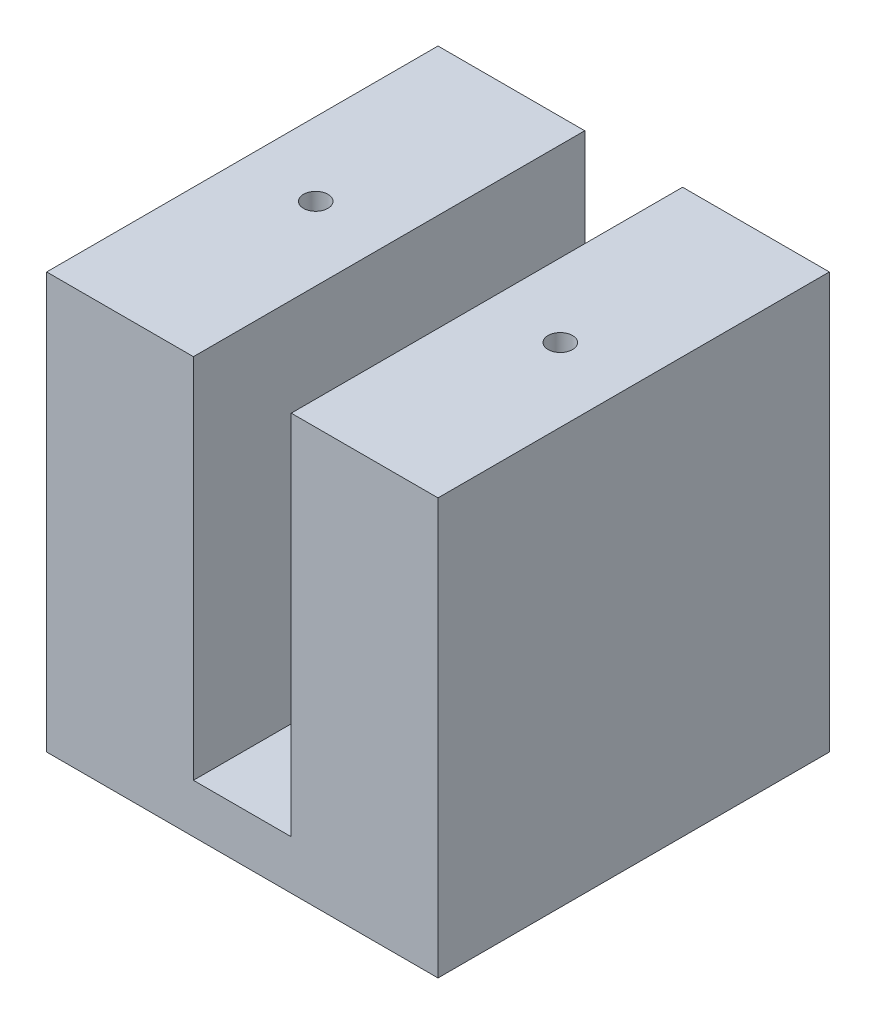
ISO-10303-21;
HEADER;
FILE_DESCRIPTION(('STEP AP214'),'2;1');
FILE_NAME('part.step','',(''),(''),'','','');
FILE_SCHEMA(('AUTOMOTIVE_DESIGN { 1 0 10303 214 1 1 1 1 }'));
ENDSEC;
DATA;
#1=APPLICATION_CONTEXT('core data for automotive mechanical design processes');
#2=APPLICATION_PROTOCOL_DEFINITION('international standard','automotive_design',2000,#1);
#3=PRODUCT_CONTEXT('',#1,'mechanical');
#4=PRODUCT('Part','Part','',(#3));
#5=PRODUCT_RELATED_PRODUCT_CATEGORY('part','',(#4));
#6=PRODUCT_DEFINITION_FORMATION('','',#4);
#7=PRODUCT_DEFINITION_CONTEXT('part definition',#1,'design');
#8=PRODUCT_DEFINITION('design','',#6,#7);
#9=PRODUCT_DEFINITION_SHAPE('','',#8);
#10=(LENGTH_UNIT() NAMED_UNIT(*) SI_UNIT(.MILLI.,.METRE.));
#11=(NAMED_UNIT(*) PLANE_ANGLE_UNIT() SI_UNIT($,.RADIAN.));
#12=(NAMED_UNIT(*) SI_UNIT($,.STERADIAN.) SOLID_ANGLE_UNIT());
#13=UNCERTAINTY_MEASURE_WITH_UNIT(LENGTH_MEASURE(1.E-05),#10,'distance_accuracy_value','');
#14=(GEOMETRIC_REPRESENTATION_CONTEXT(3) GLOBAL_UNCERTAINTY_ASSIGNED_CONTEXT((#13)) GLOBAL_UNIT_ASSIGNED_CONTEXT((#10,
#11,#12)) REPRESENTATION_CONTEXT('',''));
#15=CARTESIAN_POINT('',(0.,0.,0.));
#16=DIRECTION('',(0.,0.,1.));
#17=DIRECTION('',(1.,0.,0.));
#18=AXIS2_PLACEMENT_3D('',#15,#16,#17);
#19=CARTESIAN_POINT('',(0.,6.35,0.));
#20=DIRECTION('',(0.,-1.,0.));
#21=DIRECTION('',(0.,0.,-1.));
#22=AXIS2_PLACEMENT_3D('',#19,#20,#21);
#23=PLANE('',#22);
#24=CARTESIAN_POINT('',(0.,6.35,-6.35));
#25=DIRECTION('',(0.,1.,0.));
#26=DIRECTION('',(0.,0.,1.));
#27=AXIS2_PLACEMENT_3D('',#24,#25,#26);
#28=CIRCLE('',#27,1.5875);
#29=CARTESIAN_POINT('',(0.,6.35,-4.7625));
#30=VERTEX_POINT('',#29);
#31=EDGE_CURVE('E322',#30,#30,#28,.T.);
#32=ORIENTED_EDGE('',*,*,#31,.F.);
#33=EDGE_LOOP('',(#32));
#34=FACE_BOUND('',#33,.T.);
#35=CARTESIAN_POINT('',(0.,6.35,6.35));
#36=DIRECTION('',(0.,1.,0.));
#37=DIRECTION('',(0.,0.,1.));
#38=AXIS2_PLACEMENT_3D('',#35,#36,#37);
#39=CIRCLE('',#38,1.5875);
#40=CARTESIAN_POINT('',(0.,6.35,7.9375));
#41=VERTEX_POINT('',#40);
#42=EDGE_CURVE('E130',#41,#41,#39,.T.);
#43=ORIENTED_EDGE('',*,*,#42,.F.);
#44=EDGE_LOOP('',(#43));
#45=FACE_BOUND('',#44,.T.);
#46=DIRECTION('',(0.,0.,1.));
#47=VECTOR('',#46,1.);
#48=CARTESIAN_POINT('',(6.34999999999999,6.35,-25.4));
#49=LINE('',#48,#47);
#50=CARTESIAN_POINT('',(6.34999999999999,6.35,-25.4));
#51=VERTEX_POINT('',#50);
#52=CARTESIAN_POINT('',(6.34999999999999,6.35,25.4));
#53=VERTEX_POINT('',#52);
#54=EDGE_CURVE('E55',#51,#53,#49,.T.);
#55=ORIENTED_EDGE('',*,*,#54,.F.);
#56=DIRECTION('',(-1.,0.,0.));
#57=VECTOR('',#56,1.);
#58=CARTESIAN_POINT('',(-25.4,6.35,-25.4));
#59=LINE('',#58,#57);
#60=CARTESIAN_POINT('',(-6.35,6.35,-25.4));
#61=VERTEX_POINT('',#60);
#62=EDGE_CURVE('E169',#51,#61,#59,.T.);
#63=ORIENTED_EDGE('',*,*,#62,.T.);
#64=DIRECTION('',(0.,0.,-1.));
#65=VECTOR('',#64,1.);
#66=CARTESIAN_POINT('',(-6.35,6.35,-25.4));
#67=LINE('',#66,#65);
#68=CARTESIAN_POINT('',(-6.35,6.35,25.4));
#69=VERTEX_POINT('',#68);
#70=EDGE_CURVE('E143',#69,#61,#67,.T.);
#71=ORIENTED_EDGE('',*,*,#70,.F.);
#72=DIRECTION('',(1.,0.,0.));
#73=VECTOR('',#72,1.);
#74=CARTESIAN_POINT('',(-25.4,6.35,25.4));
#75=LINE('',#74,#73);
#76=EDGE_CURVE('E60',#69,#53,#75,.T.);
#77=ORIENTED_EDGE('',*,*,#76,.T.);
#78=EDGE_LOOP('',(#55,#63,#71,#77));
#79=FACE_BOUND('',#78,.T.);
#80=ADVANCED_FACE('F39',(#34,#45,#79),#23,.F.);
#81=CARTESIAN_POINT('',(25.4,6.35,25.4));
#82=DIRECTION('',(-1.,0.,0.));
#83=DIRECTION('',(0.,0.,1.));
#84=AXIS2_PLACEMENT_3D('',#81,#82,#83);
#85=PLANE('',#84);
#86=DIRECTION('',(0.,0.,-1.));
#87=VECTOR('',#86,1.);
#88=CARTESIAN_POINT('',(25.4,0.,25.4));
#89=LINE('',#88,#87);
#90=CARTESIAN_POINT('',(25.4,0.,25.4));
#91=VERTEX_POINT('',#90);
#92=CARTESIAN_POINT('',(25.4,0.,-25.4));
#93=VERTEX_POINT('',#92);
#94=EDGE_CURVE('E108',#91,#93,#89,.T.);
#95=ORIENTED_EDGE('',*,*,#94,.T.);
#96=DIRECTION('',(0.,-1.,0.));
#97=VECTOR('',#96,1.);
#98=CARTESIAN_POINT('',(25.4,6.35,-25.4));
#99=LINE('',#98,#97);
#100=CARTESIAN_POINT('',(25.4,53.975,-25.4));
#101=VERTEX_POINT('',#100);
#102=EDGE_CURVE('E11',#101,#93,#99,.T.);
#103=ORIENTED_EDGE('',*,*,#102,.F.);
#104=DIRECTION('',(0.,0.,-1.));
#105=VECTOR('',#104,1.);
#106=CARTESIAN_POINT('',(25.4,53.975,-25.4));
#107=LINE('',#106,#105);
#108=CARTESIAN_POINT('',(25.4,53.975,25.4));
#109=VERTEX_POINT('',#108);
#110=EDGE_CURVE('E106',#109,#101,#107,.T.);
#111=ORIENTED_EDGE('',*,*,#110,.F.);
#112=DIRECTION('',(0.,-1.,0.));
#113=VECTOR('',#112,1.);
#114=CARTESIAN_POINT('',(25.4,6.35,25.4));
#115=LINE('',#114,#113);
#116=EDGE_CURVE('E175',#109,#91,#115,.T.);
#117=ORIENTED_EDGE('',*,*,#116,.T.);
#118=EDGE_LOOP('',(#95,#103,#111,#117));
#119=FACE_BOUND('',#118,.T.);
#120=ADVANCED_FACE('F41',(#119),#85,.F.);
#121=CARTESIAN_POINT('',(-25.4,6.35,-25.4));
#122=DIRECTION('',(0.,0.,1.));
#123=DIRECTION('',(1.,0.,0.));
#124=AXIS2_PLACEMENT_3D('',#121,#122,#123);
#125=PLANE('',#124);
#126=DIRECTION('',(-1.,0.,0.));
#127=VECTOR('',#126,1.);
#128=CARTESIAN_POINT('',(-25.4,0.,-25.4));
#129=LINE('',#128,#127);
#130=CARTESIAN_POINT('',(-25.4,0.,-25.4));
#131=VERTEX_POINT('',#130);
#132=EDGE_CURVE('E178',#93,#131,#129,.T.);
#133=ORIENTED_EDGE('',*,*,#132,.T.);
#134=DIRECTION('',(0.,-1.,0.));
#135=VECTOR('',#134,1.);
#136=CARTESIAN_POINT('',(-25.4,6.35,-25.4));
#137=LINE('',#136,#135);
#138=CARTESIAN_POINT('',(-25.4,53.975,-25.4));
#139=VERTEX_POINT('',#138);
#140=EDGE_CURVE('E48',#139,#131,#137,.T.);
#141=ORIENTED_EDGE('',*,*,#140,.F.);
#142=DIRECTION('',(-1.,0.,0.));
#143=VECTOR('',#142,1.);
#144=CARTESIAN_POINT('',(-25.4,53.975,-25.4));
#145=LINE('',#144,#143);
#146=CARTESIAN_POINT('',(-6.35,53.975,-25.4));
#147=VERTEX_POINT('',#146);
#148=EDGE_CURVE('E154',#147,#139,#145,.T.);
#149=ORIENTED_EDGE('',*,*,#148,.F.);
#150=DIRECTION('',(0.,-1.,0.));
#151=VECTOR('',#150,1.);
#152=CARTESIAN_POINT('',(-6.35,53.975,-25.4));
#153=LINE('',#152,#151);
#154=EDGE_CURVE('E158',#147,#61,#153,.T.);
#155=ORIENTED_EDGE('',*,*,#154,.T.);
#156=ORIENTED_EDGE('',*,*,#62,.F.);
#157=DIRECTION('',(0.,-1.,0.));
#158=VECTOR('',#157,1.);
#159=CARTESIAN_POINT('',(6.34999999999999,53.975,-25.4));
#160=LINE('',#159,#158);
#161=CARTESIAN_POINT('',(6.34999999999999,53.975,-25.4));
#162=VERTEX_POINT('',#161);
#163=EDGE_CURVE('E114',#162,#51,#160,.T.);
#164=ORIENTED_EDGE('',*,*,#163,.F.);
#165=DIRECTION('',(-1.,0.,0.));
#166=VECTOR('',#165,1.);
#167=CARTESIAN_POINT('',(25.4,53.975,-25.4));
#168=LINE('',#167,#166);
#169=EDGE_CURVE('E111',#101,#162,#168,.T.);
#170=ORIENTED_EDGE('',*,*,#169,.F.);
#171=ORIENTED_EDGE('',*,*,#102,.T.);
#172=EDGE_LOOP('',(#133,#141,#149,#155,#156,#164,#170,#171));
#173=FACE_BOUND('',#172,.T.);
#174=ADVANCED_FACE('F112',(#173),#125,.F.);
#175=CARTESIAN_POINT('',(-25.4,6.35,25.4));
#176=DIRECTION('',(1.,0.,0.));
#177=DIRECTION('',(0.,0.,-1.));
#178=AXIS2_PLACEMENT_3D('',#175,#176,#177);
#179=PLANE('',#178);
#180=DIRECTION('',(0.,0.,1.));
#181=VECTOR('',#180,1.);
#182=CARTESIAN_POINT('',(-25.4,0.,25.4));
#183=LINE('',#182,#181);
#184=CARTESIAN_POINT('',(-25.4,0.,25.4));
#185=VERTEX_POINT('',#184);
#186=EDGE_CURVE('E181',#131,#185,#183,.T.);
#187=ORIENTED_EDGE('',*,*,#186,.T.);
#188=DIRECTION('',(0.,-1.,0.));
#189=VECTOR('',#188,1.);
#190=CARTESIAN_POINT('',(-25.4,6.35,25.4));
#191=LINE('',#190,#189);
#192=CARTESIAN_POINT('',(-25.4,53.975,25.4));
#193=VERTEX_POINT('',#192);
#194=EDGE_CURVE('E188',#193,#185,#191,.T.);
#195=ORIENTED_EDGE('',*,*,#194,.F.);
#196=DIRECTION('',(0.,0.,1.));
#197=VECTOR('',#196,1.);
#198=CARTESIAN_POINT('',(-25.4,53.975,-25.4));
#199=LINE('',#198,#197);
#200=EDGE_CURVE('E144',#139,#193,#199,.T.);
#201=ORIENTED_EDGE('',*,*,#200,.F.);
#202=ORIENTED_EDGE('',*,*,#140,.T.);
#203=EDGE_LOOP('',(#187,#195,#201,#202));
#204=FACE_BOUND('',#203,.T.);
#205=ADVANCED_FACE('F196',(#204),#179,.F.);
#206=CARTESIAN_POINT('',(-25.4,6.35,25.4));
#207=DIRECTION('',(0.,0.,-1.));
#208=DIRECTION('',(-1.,0.,0.));
#209=AXIS2_PLACEMENT_3D('',#206,#207,#208);
#210=PLANE('',#209);
#211=DIRECTION('',(1.,0.,0.));
#212=VECTOR('',#211,1.);
#213=CARTESIAN_POINT('',(-25.4,0.,25.4));
#214=LINE('',#213,#212);
#215=EDGE_CURVE('E172',#185,#91,#214,.T.);
#216=ORIENTED_EDGE('',*,*,#215,.T.);
#217=ORIENTED_EDGE('',*,*,#116,.F.);
#218=DIRECTION('',(1.,0.,0.));
#219=VECTOR('',#218,1.);
#220=CARTESIAN_POINT('',(25.4,53.975,25.4));
#221=LINE('',#220,#219);
#222=CARTESIAN_POINT('',(6.35,53.975,25.4));
#223=VERTEX_POINT('',#222);
#224=EDGE_CURVE('E123',#223,#109,#221,.T.);
#225=ORIENTED_EDGE('',*,*,#224,.F.);
#226=DIRECTION('',(0.,-1.,0.));
#227=VECTOR('',#226,1.);
#228=CARTESIAN_POINT('',(6.35,53.975,25.4));
#229=LINE('',#228,#227);
#230=EDGE_CURVE('E136',#223,#53,#229,.T.);
#231=ORIENTED_EDGE('',*,*,#230,.T.);
#232=ORIENTED_EDGE('',*,*,#76,.F.);
#233=DIRECTION('',(0.,-1.,0.));
#234=VECTOR('',#233,1.);
#235=CARTESIAN_POINT('',(-6.34999999999999,53.975,25.4));
#236=LINE('',#235,#234);
#237=CARTESIAN_POINT('',(-6.34999999999999,53.975,25.4));
#238=VERTEX_POINT('',#237);
#239=EDGE_CURVE('E165',#238,#69,#236,.T.);
#240=ORIENTED_EDGE('',*,*,#239,.F.);
#241=DIRECTION('',(1.,0.,0.));
#242=VECTOR('',#241,1.);
#243=CARTESIAN_POINT('',(-25.4,53.975,25.4));
#244=LINE('',#243,#242);
#245=EDGE_CURVE('E148',#193,#238,#244,.T.);
#246=ORIENTED_EDGE('',*,*,#245,.F.);
#247=ORIENTED_EDGE('',*,*,#194,.T.);
#248=EDGE_LOOP('',(#216,#217,#225,#231,#232,#240,#246,#247));
#249=FACE_BOUND('',#248,.T.);
#250=ADVANCED_FACE('F202',(#249),#210,.F.);
#251=CARTESIAN_POINT('',(0.,0.,0.));
#252=DIRECTION('',(0.,-1.,0.));
#253=DIRECTION('',(0.,0.,-1.));
#254=AXIS2_PLACEMENT_3D('',#251,#252,#253);
#255=PLANE('',#254);
#256=CARTESIAN_POINT('',(-15.875,0.,0.));
#257=DIRECTION('',(0.,1.,0.));
#258=DIRECTION('',(0.,0.,1.));
#259=AXIS2_PLACEMENT_3D('',#256,#257,#258);
#260=CIRCLE('',#259,1.5875);
#261=CARTESIAN_POINT('',(-15.875,0.,1.5875));
#262=VERTEX_POINT('',#261);
#263=EDGE_CURVE('E319',#262,#262,#260,.T.);
#264=ORIENTED_EDGE('',*,*,#263,.T.);
#265=EDGE_LOOP('',(#264));
#266=FACE_BOUND('',#265,.T.);
#267=CARTESIAN_POINT('',(15.875,0.,0.));
#268=DIRECTION('',(0.,1.,0.));
#269=DIRECTION('',(0.,0.,1.));
#270=AXIS2_PLACEMENT_3D('',#267,#268,#269);
#271=CIRCLE('',#270,1.5875);
#272=CARTESIAN_POINT('',(15.875,0.,1.5875));
#273=VERTEX_POINT('',#272);
#274=EDGE_CURVE('E328',#273,#273,#271,.T.);
#275=ORIENTED_EDGE('',*,*,#274,.T.);
#276=EDGE_LOOP('',(#275));
#277=FACE_BOUND('',#276,.T.);
#278=CARTESIAN_POINT('',(0.,0.,-6.35));
#279=DIRECTION('',(0.,1.,0.));
#280=DIRECTION('',(0.,0.,1.));
#281=AXIS2_PLACEMENT_3D('',#278,#279,#280);
#282=CIRCLE('',#281,1.5875);
#283=CARTESIAN_POINT('',(0.,0.,-4.7625));
#284=VERTEX_POINT('',#283);
#285=EDGE_CURVE('E127',#284,#284,#282,.T.);
#286=ORIENTED_EDGE('',*,*,#285,.T.);
#287=EDGE_LOOP('',(#286));
#288=FACE_BOUND('',#287,.T.);
#289=CARTESIAN_POINT('',(0.,0.,6.35));
#290=DIRECTION('',(0.,1.,0.));
#291=DIRECTION('',(0.,0.,1.));
#292=AXIS2_PLACEMENT_3D('',#289,#290,#291);
#293=CIRCLE('',#292,1.5875);
#294=CARTESIAN_POINT('',(0.,0.,7.9375));
#295=VERTEX_POINT('',#294);
#296=EDGE_CURVE('E315',#295,#295,#293,.T.);
#297=ORIENTED_EDGE('',*,*,#296,.T.);
#298=EDGE_LOOP('',(#297));
#299=FACE_BOUND('',#298,.T.);
#300=ORIENTED_EDGE('',*,*,#94,.F.);
#301=ORIENTED_EDGE('',*,*,#215,.F.);
#302=ORIENTED_EDGE('',*,*,#186,.F.);
#303=ORIENTED_EDGE('',*,*,#132,.F.);
#304=EDGE_LOOP('',(#300,#301,#302,#303));
#305=FACE_BOUND('',#304,.T.);
#306=ADVANCED_FACE('F200',(#266,#277,#288,#299,#305),#255,.T.);
#307=CARTESIAN_POINT('',(-6.35,53.975,-25.4));
#308=DIRECTION('',(-1.,0.,0.));
#309=DIRECTION('',(0.,0.,1.));
#310=AXIS2_PLACEMENT_3D('',#307,#308,#309);
#311=PLANE('',#310);
#312=ORIENTED_EDGE('',*,*,#70,.T.);
#313=ORIENTED_EDGE('',*,*,#154,.F.);
#314=DIRECTION('',(0.,0.,-1.));
#315=VECTOR('',#314,1.);
#316=CARTESIAN_POINT('',(-6.35,53.975,-25.4));
#317=LINE('',#316,#315);
#318=EDGE_CURVE('E151',#238,#147,#317,.T.);
#319=ORIENTED_EDGE('',*,*,#318,.F.);
#320=ORIENTED_EDGE('',*,*,#239,.T.);
#321=EDGE_LOOP('',(#312,#313,#319,#320));
#322=FACE_BOUND('',#321,.T.);
#323=ADVANCED_FACE('F210',(#322),#311,.F.);
#324=CARTESIAN_POINT('',(0.,53.975,0.));
#325=DIRECTION('',(0.,1.,0.));
#326=DIRECTION('',(0.,0.,1.));
#327=AXIS2_PLACEMENT_3D('',#324,#325,#326);
#328=PLANE('',#327);
#329=CARTESIAN_POINT('',(-15.875,53.975,0.));
#330=DIRECTION('',(0.,1.,0.));
#331=DIRECTION('',(0.,0.,1.));
#332=AXIS2_PLACEMENT_3D('',#329,#330,#331);
#333=CIRCLE('',#332,1.5875);
#334=CARTESIAN_POINT('',(-15.875,53.975,1.5875));
#335=VERTEX_POINT('',#334);
#336=EDGE_CURVE('E324',#335,#335,#333,.T.);
#337=ORIENTED_EDGE('',*,*,#336,.F.);
#338=EDGE_LOOP('',(#337));
#339=FACE_BOUND('',#338,.T.);
#340=ORIENTED_EDGE('',*,*,#200,.T.);
#341=ORIENTED_EDGE('',*,*,#245,.T.);
#342=ORIENTED_EDGE('',*,*,#318,.T.);
#343=ORIENTED_EDGE('',*,*,#148,.T.);
#344=EDGE_LOOP('',(#340,#341,#342,#343));
#345=FACE_BOUND('',#344,.T.);
#346=ADVANCED_FACE('F207',(#339,#345),#328,.T.);
#347=CARTESIAN_POINT('',(6.34999999999999,53.975,-25.4));
#348=DIRECTION('',(1.,0.,0.));
#349=DIRECTION('',(0.,0.,-1.));
#350=AXIS2_PLACEMENT_3D('',#347,#348,#349);
#351=PLANE('',#350);
#352=ORIENTED_EDGE('',*,*,#54,.T.);
#353=ORIENTED_EDGE('',*,*,#230,.F.);
#354=DIRECTION('',(0.,0.,1.));
#355=VECTOR('',#354,1.);
#356=CARTESIAN_POINT('',(6.34999999999999,53.975,-25.4));
#357=LINE('',#356,#355);
#358=EDGE_CURVE('E118',#162,#223,#357,.T.);
#359=ORIENTED_EDGE('',*,*,#358,.F.);
#360=ORIENTED_EDGE('',*,*,#163,.T.);
#361=EDGE_LOOP('',(#352,#353,#359,#360));
#362=FACE_BOUND('',#361,.T.);
#363=ADVANCED_FACE('F213',(#362),#351,.F.);
#364=CARTESIAN_POINT('',(0.,53.975,0.));
#365=DIRECTION('',(0.,-1.,0.));
#366=DIRECTION('',(0.,0.,-1.));
#367=AXIS2_PLACEMENT_3D('',#364,#365,#366);
#368=PLANE('',#367);
#369=CARTESIAN_POINT('',(15.875,53.975,0.));
#370=DIRECTION('',(0.,1.,0.));
#371=DIRECTION('',(0.,0.,1.));
#372=AXIS2_PLACEMENT_3D('',#369,#370,#371);
#373=CIRCLE('',#372,1.5875);
#374=CARTESIAN_POINT('',(15.875,53.975,1.5875));
#375=VERTEX_POINT('',#374);
#376=EDGE_CURVE('E334',#375,#375,#373,.T.);
#377=ORIENTED_EDGE('',*,*,#376,.F.);
#378=EDGE_LOOP('',(#377));
#379=FACE_BOUND('',#378,.T.);
#380=ORIENTED_EDGE('',*,*,#110,.T.);
#381=ORIENTED_EDGE('',*,*,#169,.T.);
#382=ORIENTED_EDGE('',*,*,#358,.T.);
#383=ORIENTED_EDGE('',*,*,#224,.T.);
#384=EDGE_LOOP('',(#380,#381,#382,#383));
#385=FACE_BOUND('',#384,.T.);
#386=ADVANCED_FACE('F121',(#379,#385),#368,.F.);
#387=CARTESIAN_POINT('',(0.,0.,6.35));
#388=DIRECTION('',(0.,1.,0.));
#389=DIRECTION('',(0.,0.,1.));
#390=AXIS2_PLACEMENT_3D('',#387,#388,#389);
#391=CYLINDRICAL_SURFACE('',#390,1.5875);
#392=ORIENTED_EDGE('',*,*,#296,.F.);
#393=EDGE_LOOP('',(#392));
#394=FACE_BOUND('',#393,.T.);
#395=ORIENTED_EDGE('',*,*,#42,.T.);
#396=EDGE_LOOP('',(#395));
#397=FACE_BOUND('',#396,.T.);
#398=ADVANCED_FACE('F220',(#394,#397),#391,.F.);
#399=CARTESIAN_POINT('',(0.,0.,-6.35));
#400=DIRECTION('',(0.,1.,0.));
#401=DIRECTION('',(0.,0.,1.));
#402=AXIS2_PLACEMENT_3D('',#399,#400,#401);
#403=CYLINDRICAL_SURFACE('',#402,1.5875);
#404=ORIENTED_EDGE('',*,*,#285,.F.);
#405=EDGE_LOOP('',(#404));
#406=FACE_BOUND('',#405,.T.);
#407=ORIENTED_EDGE('',*,*,#31,.T.);
#408=EDGE_LOOP('',(#407));
#409=FACE_BOUND('',#408,.T.);
#410=ADVANCED_FACE('F288',(#406,#409),#403,.F.);
#411=CARTESIAN_POINT('',(15.875,0.,0.));
#412=DIRECTION('',(0.,1.,0.));
#413=DIRECTION('',(0.,0.,1.));
#414=AXIS2_PLACEMENT_3D('',#411,#412,#413);
#415=CYLINDRICAL_SURFACE('',#414,1.5875);
#416=ORIENTED_EDGE('',*,*,#274,.F.);
#417=EDGE_LOOP('',(#416));
#418=FACE_BOUND('',#417,.T.);
#419=ORIENTED_EDGE('',*,*,#376,.T.);
#420=EDGE_LOOP('',(#419));
#421=FACE_BOUND('',#420,.T.);
#422=ADVANCED_FACE('F282',(#418,#421),#415,.F.);
#423=CARTESIAN_POINT('',(-15.875,0.,0.));
#424=DIRECTION('',(0.,1.,0.));
#425=DIRECTION('',(0.,0.,1.));
#426=AXIS2_PLACEMENT_3D('',#423,#424,#425);
#427=CYLINDRICAL_SURFACE('',#426,1.5875);
#428=ORIENTED_EDGE('',*,*,#263,.F.);
#429=EDGE_LOOP('',(#428));
#430=FACE_BOUND('',#429,.T.);
#431=ORIENTED_EDGE('',*,*,#336,.T.);
#432=EDGE_LOOP('',(#431));
#433=FACE_BOUND('',#432,.T.);
#434=ADVANCED_FACE('F287',(#430,#433),#427,.F.);
#435=CLOSED_SHELL('',(#80,#120,#174,#205,#250,#306,#323,#346,#363,#386,#398,#410,#422,#434));
#436=MANIFOLD_SOLID_BREP('B2',#435);
#437=ADVANCED_BREP_SHAPE_REPRESENTATION('',(#18,#436),#14);
#438=SHAPE_DEFINITION_REPRESENTATION(#9,#437);
ENDSEC;
END-ISO-10303-21;
